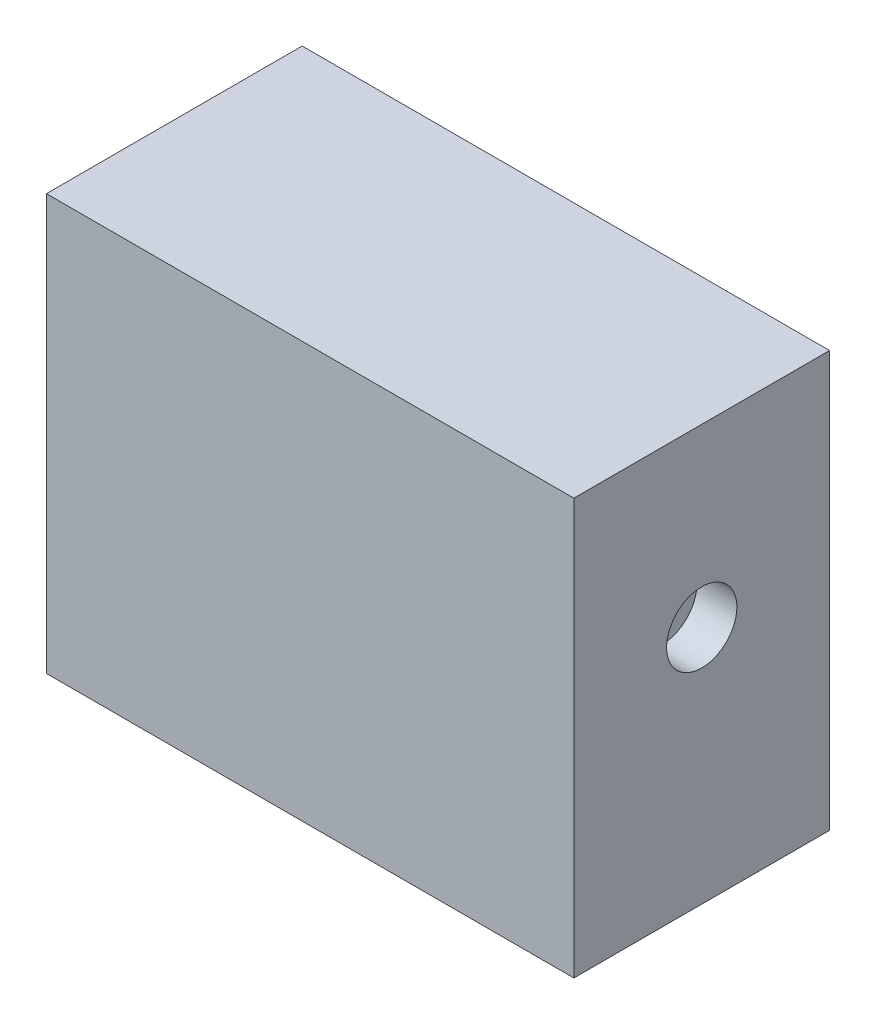
ISO-10303-21;
HEADER;
FILE_DESCRIPTION(('STEP AP214'),'2;1');
FILE_NAME('part.step','',(''),(''),'','','');
FILE_SCHEMA(('AUTOMOTIVE_DESIGN { 1 0 10303 214 1 1 1 1 }'));
ENDSEC;
DATA;
#1=APPLICATION_CONTEXT('core data for automotive mechanical design processes');
#2=APPLICATION_PROTOCOL_DEFINITION('international standard','automotive_design',2000,#1);
#3=PRODUCT_CONTEXT('',#1,'mechanical');
#4=PRODUCT('Part','Part','',(#3));
#5=PRODUCT_RELATED_PRODUCT_CATEGORY('part','',(#4));
#6=PRODUCT_DEFINITION_FORMATION('','',#4);
#7=PRODUCT_DEFINITION_CONTEXT('part definition',#1,'design');
#8=PRODUCT_DEFINITION('design','',#6,#7);
#9=PRODUCT_DEFINITION_SHAPE('','',#8);
#10=(LENGTH_UNIT() NAMED_UNIT(*) SI_UNIT(.MILLI.,.METRE.));
#11=(NAMED_UNIT(*) PLANE_ANGLE_UNIT() SI_UNIT($,.RADIAN.));
#12=(NAMED_UNIT(*) SI_UNIT($,.STERADIAN.) SOLID_ANGLE_UNIT());
#13=UNCERTAINTY_MEASURE_WITH_UNIT(LENGTH_MEASURE(1.E-05),#10,'distance_accuracy_value','');
#14=(GEOMETRIC_REPRESENTATION_CONTEXT(3) GLOBAL_UNCERTAINTY_ASSIGNED_CONTEXT((#13)) GLOBAL_UNIT_ASSIGNED_CONTEXT((#10,
#11,#12)) REPRESENTATION_CONTEXT('',''));
#15=CARTESIAN_POINT('',(0.,0.,0.));
#16=DIRECTION('',(0.,0.,1.));
#17=DIRECTION('',(1.,0.,0.));
#18=AXIS2_PLACEMENT_3D('',#15,#16,#17);
#19=CARTESIAN_POINT('',(165.,260.,80.));
#20=DIRECTION('',(-1.,0.,0.));
#21=DIRECTION('',(0.,0.,1.));
#22=AXIS2_PLACEMENT_3D('',#19,#20,#21);
#23=PLANE('',#22);
#24=CARTESIAN_POINT('',(165.,150.,0.));
#25=DIRECTION('',(1.,0.,0.));
#26=DIRECTION('',(0.,0.,-1.));
#27=AXIS2_PLACEMENT_3D('',#24,#25,#26);
#28=CIRCLE('',#27,22.);
#29=CARTESIAN_POINT('',(165.,150.,-22.));
#30=VERTEX_POINT('',#29);
#31=EDGE_CURVE('E109',#30,#30,#28,.T.);
#32=ORIENTED_EDGE('',*,*,#31,.F.);
#33=EDGE_LOOP('',(#32));
#34=FACE_BOUND('',#33,.T.);
#35=DIRECTION('',(0.,0.,-1.));
#36=VECTOR('',#35,1.);
#37=CARTESIAN_POINT('',(165.,0.,80.));
#38=LINE('',#37,#36);
#39=CARTESIAN_POINT('',(165.,0.,80.));
#40=VERTEX_POINT('',#39);
#41=CARTESIAN_POINT('',(165.,0.,-80.));
#42=VERTEX_POINT('',#41);
#43=EDGE_CURVE('E95',#40,#42,#38,.T.);
#44=ORIENTED_EDGE('',*,*,#43,.T.);
#45=DIRECTION('',(0.,-1.,0.));
#46=VECTOR('',#45,1.);
#47=CARTESIAN_POINT('',(165.,260.,-80.));
#48=LINE('',#47,#46);
#49=CARTESIAN_POINT('',(165.,260.,-80.));
#50=VERTEX_POINT('',#49);
#51=EDGE_CURVE('E11',#50,#42,#48,.T.);
#52=ORIENTED_EDGE('',*,*,#51,.F.);
#53=DIRECTION('',(0.,0.,-1.));
#54=VECTOR('',#53,1.);
#55=CARTESIAN_POINT('',(165.,260.,80.));
#56=LINE('',#55,#54);
#57=CARTESIAN_POINT('',(165.,260.,80.));
#58=VERTEX_POINT('',#57);
#59=EDGE_CURVE('E83',#58,#50,#56,.T.);
#60=ORIENTED_EDGE('',*,*,#59,.F.);
#61=DIRECTION('',(0.,-1.,0.));
#62=VECTOR('',#61,1.);
#63=CARTESIAN_POINT('',(165.,260.,80.));
#64=LINE('',#63,#62);
#65=EDGE_CURVE('E91',#58,#40,#64,.T.);
#66=ORIENTED_EDGE('',*,*,#65,.T.);
#67=EDGE_LOOP('',(#44,#52,#60,#66));
#68=FACE_BOUND('',#67,.T.);
#69=ADVANCED_FACE('F32',(#34,#68),#23,.F.);
#70=CARTESIAN_POINT('',(-165.,260.,-80.));
#71=DIRECTION('',(0.,0.,1.));
#72=DIRECTION('',(1.,0.,0.));
#73=AXIS2_PLACEMENT_3D('',#70,#71,#72);
#74=PLANE('',#73);
#75=DIRECTION('',(-1.,0.,0.));
#76=VECTOR('',#75,1.);
#77=CARTESIAN_POINT('',(-165.,0.,-80.));
#78=LINE('',#77,#76);
#79=CARTESIAN_POINT('',(-165.,0.,-80.));
#80=VERTEX_POINT('',#79);
#81=EDGE_CURVE('E87',#42,#80,#78,.T.);
#82=ORIENTED_EDGE('',*,*,#81,.T.);
#83=DIRECTION('',(0.,-1.,0.));
#84=VECTOR('',#83,1.);
#85=CARTESIAN_POINT('',(-165.,260.,-80.));
#86=LINE('',#85,#84);
#87=CARTESIAN_POINT('',(-165.,260.,-80.));
#88=VERTEX_POINT('',#87);
#89=EDGE_CURVE('E40',#88,#80,#86,.T.);
#90=ORIENTED_EDGE('',*,*,#89,.F.);
#91=DIRECTION('',(-1.,0.,0.));
#92=VECTOR('',#91,1.);
#93=CARTESIAN_POINT('',(-165.,260.,-80.));
#94=LINE('',#93,#92);
#95=EDGE_CURVE('E78',#50,#88,#94,.T.);
#96=ORIENTED_EDGE('',*,*,#95,.F.);
#97=ORIENTED_EDGE('',*,*,#51,.T.);
#98=EDGE_LOOP('',(#82,#90,#96,#97));
#99=FACE_BOUND('',#98,.T.);
#100=ADVANCED_FACE('F86',(#99),#74,.F.);
#101=CARTESIAN_POINT('',(-165.,260.,80.));
#102=DIRECTION('',(1.,0.,0.));
#103=DIRECTION('',(0.,0.,-1.));
#104=AXIS2_PLACEMENT_3D('',#101,#102,#103);
#105=PLANE('',#104);
#106=DIRECTION('',(0.,0.,1.));
#107=VECTOR('',#106,1.);
#108=CARTESIAN_POINT('',(-165.,0.,80.));
#109=LINE('',#108,#107);
#110=CARTESIAN_POINT('',(-165.,0.,80.));
#111=VERTEX_POINT('',#110);
#112=EDGE_CURVE('E65',#80,#111,#109,.T.);
#113=ORIENTED_EDGE('',*,*,#112,.T.);
#114=DIRECTION('',(0.,-1.,0.));
#115=VECTOR('',#114,1.);
#116=CARTESIAN_POINT('',(-165.,260.,80.));
#117=LINE('',#116,#115);
#118=CARTESIAN_POINT('',(-165.,260.,80.));
#119=VERTEX_POINT('',#118);
#120=EDGE_CURVE('E88',#119,#111,#117,.T.);
#121=ORIENTED_EDGE('',*,*,#120,.F.);
#122=DIRECTION('',(0.,0.,1.));
#123=VECTOR('',#122,1.);
#124=CARTESIAN_POINT('',(-165.,260.,80.));
#125=LINE('',#124,#123);
#126=EDGE_CURVE('E81',#88,#119,#125,.T.);
#127=ORIENTED_EDGE('',*,*,#126,.F.);
#128=ORIENTED_EDGE('',*,*,#89,.T.);
#129=EDGE_LOOP('',(#113,#121,#127,#128));
#130=FACE_BOUND('',#129,.T.);
#131=ADVANCED_FACE('F89',(#130),#105,.F.);
#132=CARTESIAN_POINT('',(-165.,260.,80.));
#133=DIRECTION('',(0.,0.,-1.));
#134=DIRECTION('',(-1.,0.,0.));
#135=AXIS2_PLACEMENT_3D('',#132,#133,#134);
#136=PLANE('',#135);
#137=DIRECTION('',(1.,0.,0.));
#138=VECTOR('',#137,1.);
#139=CARTESIAN_POINT('',(-165.,0.,80.));
#140=LINE('',#139,#138);
#141=EDGE_CURVE('E71',#111,#40,#140,.T.);
#142=ORIENTED_EDGE('',*,*,#141,.T.);
#143=ORIENTED_EDGE('',*,*,#65,.F.);
#144=DIRECTION('',(1.,0.,0.));
#145=VECTOR('',#144,1.);
#146=CARTESIAN_POINT('',(-165.,260.,80.));
#147=LINE('',#146,#145);
#148=EDGE_CURVE('E48',#119,#58,#147,.T.);
#149=ORIENTED_EDGE('',*,*,#148,.F.);
#150=ORIENTED_EDGE('',*,*,#120,.T.);
#151=EDGE_LOOP('',(#142,#143,#149,#150));
#152=FACE_BOUND('',#151,.T.);
#153=ADVANCED_FACE('F103',(#152),#136,.F.);
#154=CARTESIAN_POINT('',(0.,260.,0.));
#155=DIRECTION('',(0.,-1.,0.));
#156=DIRECTION('',(0.,0.,-1.));
#157=AXIS2_PLACEMENT_3D('',#154,#155,#156);
#158=PLANE('',#157);
#159=ORIENTED_EDGE('',*,*,#59,.T.);
#160=ORIENTED_EDGE('',*,*,#95,.T.);
#161=ORIENTED_EDGE('',*,*,#126,.T.);
#162=ORIENTED_EDGE('',*,*,#148,.T.);
#163=EDGE_LOOP('',(#159,#160,#161,#162));
#164=FACE_BOUND('',#163,.T.);
#165=ADVANCED_FACE('F79',(#164),#158,.F.);
#166=CARTESIAN_POINT('',(0.,0.,0.));
#167=DIRECTION('',(0.,-1.,0.));
#168=DIRECTION('',(0.,0.,-1.));
#169=AXIS2_PLACEMENT_3D('',#166,#167,#168);
#170=PLANE('',#169);
#171=CARTESIAN_POINT('',(32.,0.,0.));
#172=DIRECTION('',(0.,-1.,0.));
#173=DIRECTION('',(0.,0.,-1.));
#174=AXIS2_PLACEMENT_3D('',#171,#172,#173);
#175=CIRCLE('',#174,4.76250000000003);
#176=CARTESIAN_POINT('',(32.,0.,-4.76250000000003));
#177=VERTEX_POINT('',#176);
#178=EDGE_CURVE('E127',#177,#177,#175,.T.);
#179=ORIENTED_EDGE('',*,*,#178,.F.);
#180=EDGE_LOOP('',(#179));
#181=FACE_BOUND('',#180,.T.);
#182=CARTESIAN_POINT('',(-18.,0.,0.));
#183=DIRECTION('',(0.,-1.,0.));
#184=DIRECTION('',(0.,0.,-1.));
#185=AXIS2_PLACEMENT_3D('',#182,#183,#184);
#186=CIRCLE('',#185,4.7625);
#187=CARTESIAN_POINT('',(-18.,0.,-4.7625));
#188=VERTEX_POINT('',#187);
#189=EDGE_CURVE('E121',#188,#188,#186,.T.);
#190=ORIENTED_EDGE('',*,*,#189,.F.);
#191=EDGE_LOOP('',(#190));
#192=FACE_BOUND('',#191,.T.);
#193=CARTESIAN_POINT('',(82.,0.,0.));
#194=DIRECTION('',(0.,-1.,0.));
#195=DIRECTION('',(0.,0.,-1.));
#196=AXIS2_PLACEMENT_3D('',#193,#194,#195);
#197=CIRCLE('',#196,4.76250000000001);
#198=CARTESIAN_POINT('',(82.,0.,-4.76250000000001));
#199=VERTEX_POINT('',#198);
#200=EDGE_CURVE('E115',#199,#199,#197,.T.);
#201=ORIENTED_EDGE('',*,*,#200,.F.);
#202=EDGE_LOOP('',(#201));
#203=FACE_BOUND('',#202,.T.);
#204=ORIENTED_EDGE('',*,*,#43,.F.);
#205=ORIENTED_EDGE('',*,*,#141,.F.);
#206=ORIENTED_EDGE('',*,*,#112,.F.);
#207=ORIENTED_EDGE('',*,*,#81,.F.);
#208=EDGE_LOOP('',(#204,#205,#206,#207));
#209=FACE_BOUND('',#208,.T.);
#210=ADVANCED_FACE('F106',(#181,#192,#203,#209),#170,.T.);
#211=CARTESIAN_POINT('',(140.,150.,0.));
#212=DIRECTION('',(1.,0.,0.));
#213=DIRECTION('',(0.,0.,-1.));
#214=AXIS2_PLACEMENT_3D('',#211,#212,#213);
#215=CYLINDRICAL_SURFACE('',#214,22.);
#216=CARTESIAN_POINT('',(140.,150.,0.));
#217=DIRECTION('',(1.,0.,0.));
#218=DIRECTION('',(0.,0.,-1.));
#219=AXIS2_PLACEMENT_3D('',#216,#217,#218);
#220=CIRCLE('',#219,22.);
#221=CARTESIAN_POINT('',(140.,150.,-22.));
#222=VERTEX_POINT('',#221);
#223=EDGE_CURVE('E98',#222,#222,#220,.T.);
#224=ORIENTED_EDGE('',*,*,#223,.F.);
#225=EDGE_LOOP('',(#224));
#226=FACE_BOUND('',#225,.T.);
#227=ORIENTED_EDGE('',*,*,#31,.T.);
#228=EDGE_LOOP('',(#227));
#229=FACE_BOUND('',#228,.T.);
#230=ADVANCED_FACE('F144',(#226,#229),#215,.F.);
#231=CARTESIAN_POINT('',(140.,150.,0.));
#232=DIRECTION('',(1.,0.,0.));
#233=DIRECTION('',(0.,0.,-1.));
#234=AXIS2_PLACEMENT_3D('',#231,#232,#233);
#235=PLANE('',#234);
#236=ORIENTED_EDGE('',*,*,#223,.T.);
#237=EDGE_LOOP('',(#236));
#238=FACE_BOUND('',#237,.T.);
#239=ADVANCED_FACE('F153',(#238),#235,.T.);
#240=CARTESIAN_POINT('',(82.,10.,0.));
#241=DIRECTION('',(0.,-1.,0.));
#242=DIRECTION('',(0.,0.,-1.));
#243=AXIS2_PLACEMENT_3D('',#240,#241,#242);
#244=CYLINDRICAL_SURFACE('',#243,4.76250000000001);
#245=CARTESIAN_POINT('',(82.,10.,0.));
#246=DIRECTION('',(0.,-1.,0.));
#247=DIRECTION('',(0.,0.,-1.));
#248=AXIS2_PLACEMENT_3D('',#245,#246,#247);
#249=CIRCLE('',#248,4.76250000000001);
#250=CARTESIAN_POINT('',(82.,10.,-4.76250000000001));
#251=VERTEX_POINT('',#250);
#252=EDGE_CURVE('E112',#251,#251,#249,.T.);
#253=ORIENTED_EDGE('',*,*,#252,.F.);
#254=EDGE_LOOP('',(#253));
#255=FACE_BOUND('',#254,.T.);
#256=ORIENTED_EDGE('',*,*,#200,.T.);
#257=EDGE_LOOP('',(#256));
#258=FACE_BOUND('',#257,.T.);
#259=ADVANCED_FACE('F150',(#255,#258),#244,.F.);
#260=CARTESIAN_POINT('',(82.,10.,0.));
#261=DIRECTION('',(0.,-1.,0.));
#262=DIRECTION('',(0.,0.,-1.));
#263=AXIS2_PLACEMENT_3D('',#260,#261,#262);
#264=PLANE('',#263);
#265=ORIENTED_EDGE('',*,*,#252,.T.);
#266=EDGE_LOOP('',(#265));
#267=FACE_BOUND('',#266,.T.);
#268=ADVANCED_FACE('F152',(#267),#264,.T.);
#269=CARTESIAN_POINT('',(-18.,10.,0.));
#270=DIRECTION('',(0.,-1.,0.));
#271=DIRECTION('',(0.,0.,-1.));
#272=AXIS2_PLACEMENT_3D('',#269,#270,#271);
#273=CYLINDRICAL_SURFACE('',#272,4.7625);
#274=CARTESIAN_POINT('',(-18.,10.,0.));
#275=DIRECTION('',(0.,-1.,0.));
#276=DIRECTION('',(0.,0.,-1.));
#277=AXIS2_PLACEMENT_3D('',#274,#275,#276);
#278=CIRCLE('',#277,4.7625);
#279=CARTESIAN_POINT('',(-18.,10.,-4.7625));
#280=VERTEX_POINT('',#279);
#281=EDGE_CURVE('E124',#280,#280,#278,.T.);
#282=ORIENTED_EDGE('',*,*,#281,.F.);
#283=EDGE_LOOP('',(#282));
#284=FACE_BOUND('',#283,.T.);
#285=ORIENTED_EDGE('',*,*,#189,.T.);
#286=EDGE_LOOP('',(#285));
#287=FACE_BOUND('',#286,.T.);
#288=ADVANCED_FACE('F160',(#284,#287),#273,.F.);
#289=CARTESIAN_POINT('',(-18.,10.,0.));
#290=DIRECTION('',(0.,-1.,0.));
#291=DIRECTION('',(0.,0.,-1.));
#292=AXIS2_PLACEMENT_3D('',#289,#290,#291);
#293=PLANE('',#292);
#294=ORIENTED_EDGE('',*,*,#281,.T.);
#295=EDGE_LOOP('',(#294));
#296=FACE_BOUND('',#295,.T.);
#297=ADVANCED_FACE('F138',(#296),#293,.T.);
#298=CARTESIAN_POINT('',(32.,10.,0.));
#299=DIRECTION('',(0.,-1.,0.));
#300=DIRECTION('',(0.,0.,-1.));
#301=AXIS2_PLACEMENT_3D('',#298,#299,#300);
#302=CYLINDRICAL_SURFACE('',#301,4.76250000000003);
#303=CARTESIAN_POINT('',(32.,10.,0.));
#304=DIRECTION('',(0.,-1.,0.));
#305=DIRECTION('',(0.,0.,-1.));
#306=AXIS2_PLACEMENT_3D('',#303,#304,#305);
#307=CIRCLE('',#306,4.76250000000003);
#308=CARTESIAN_POINT('',(32.,10.,-4.76250000000003));
#309=VERTEX_POINT('',#308);
#310=EDGE_CURVE('E118',#309,#309,#307,.T.);
#311=ORIENTED_EDGE('',*,*,#310,.F.);
#312=EDGE_LOOP('',(#311));
#313=FACE_BOUND('',#312,.T.);
#314=ORIENTED_EDGE('',*,*,#178,.T.);
#315=EDGE_LOOP('',(#314));
#316=FACE_BOUND('',#315,.T.);
#317=ADVANCED_FACE('F135',(#313,#316),#302,.F.);
#318=CARTESIAN_POINT('',(32.,10.,0.));
#319=DIRECTION('',(0.,-1.,0.));
#320=DIRECTION('',(0.,0.,-1.));
#321=AXIS2_PLACEMENT_3D('',#318,#319,#320);
#322=PLANE('',#321);
#323=ORIENTED_EDGE('',*,*,#310,.T.);
#324=EDGE_LOOP('',(#323));
#325=FACE_BOUND('',#324,.T.);
#326=ADVANCED_FACE('F133',(#325),#322,.T.);
#327=CLOSED_SHELL('',(#69,#100,#131,#153,#165,#210,#230,#239,#259,#268,#288,#297,#317,#326));
#328=MANIFOLD_SOLID_BREP('B2',#327);
#329=ADVANCED_BREP_SHAPE_REPRESENTATION('',(#18,#328),#14);
#330=SHAPE_DEFINITION_REPRESENTATION(#9,#329);
ENDSEC;
END-ISO-10303-21;
